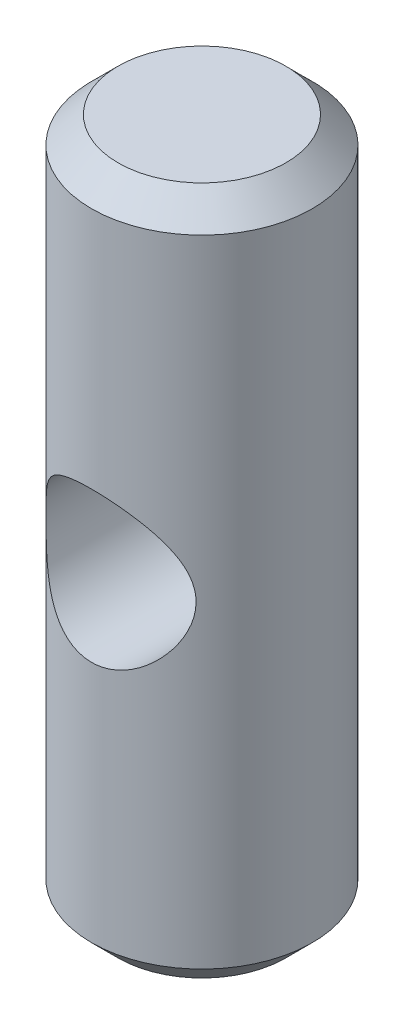
ISO-10303-21;
HEADER;
FILE_DESCRIPTION(('STEP AP214'),'2;1');
FILE_NAME('part.step','',(''),(''),'','','');
FILE_SCHEMA(('AUTOMOTIVE_DESIGN { 1 0 10303 214 1 1 1 1 }'));
ENDSEC;
DATA;
#1=APPLICATION_CONTEXT('core data for automotive mechanical design processes');
#2=APPLICATION_PROTOCOL_DEFINITION('international standard','automotive_design',2000,#1);
#3=PRODUCT_CONTEXT('',#1,'mechanical');
#4=PRODUCT('Part','Part','',(#3));
#5=PRODUCT_RELATED_PRODUCT_CATEGORY('part','',(#4));
#6=PRODUCT_DEFINITION_FORMATION('','',#4);
#7=PRODUCT_DEFINITION_CONTEXT('part definition',#1,'design');
#8=PRODUCT_DEFINITION('design','',#6,#7);
#9=PRODUCT_DEFINITION_SHAPE('','',#8);
#10=(LENGTH_UNIT() NAMED_UNIT(*) SI_UNIT(.MILLI.,.METRE.));
#11=(NAMED_UNIT(*) PLANE_ANGLE_UNIT() SI_UNIT($,.RADIAN.));
#12=(NAMED_UNIT(*) SI_UNIT($,.STERADIAN.) SOLID_ANGLE_UNIT());
#13=UNCERTAINTY_MEASURE_WITH_UNIT(LENGTH_MEASURE(1.E-05),#10,'distance_accuracy_value','');
#14=(GEOMETRIC_REPRESENTATION_CONTEXT(3) GLOBAL_UNCERTAINTY_ASSIGNED_CONTEXT((#13)) GLOBAL_UNIT_ASSIGNED_CONTEXT((#10,
#11,#12)) REPRESENTATION_CONTEXT('',''));
#15=CARTESIAN_POINT('',(0.,0.,0.));
#16=DIRECTION('',(0.,0.,1.));
#17=DIRECTION('',(1.,0.,0.));
#18=AXIS2_PLACEMENT_3D('',#15,#16,#17);
#19=CARTESIAN_POINT('',(0.,39.,0.));
#20=DIRECTION('',(0.,-1.,0.));
#21=DIRECTION('',(0.,0.,-1.));
#22=AXIS2_PLACEMENT_3D('',#19,#20,#21);
#23=CYLINDRICAL_SURFACE('',#22,12.5);
#24=CARTESIAN_POINT('',(0.,-36.,0.));
#25=DIRECTION('',(0.,1.,0.));
#26=DIRECTION('',(0.,0.,1.));
#27=AXIS2_PLACEMENT_3D('',#24,#25,#26);
#28=CIRCLE('',#27,12.5);
#29=CARTESIAN_POINT('',(0.,-36.,12.5));
#30=VERTEX_POINT('',#29);
#31=EDGE_CURVE('E43',#30,#30,#28,.T.);
#32=ORIENTED_EDGE('',*,*,#31,.T.);
#33=EDGE_LOOP('',(#32));
#34=FACE_BOUND('',#33,.T.);
#35=CARTESIAN_POINT('',(0.,36.,0.));
#36=DIRECTION('',(0.,1.,0.));
#37=DIRECTION('',(0.,0.,1.));
#38=AXIS2_PLACEMENT_3D('',#35,#36,#37);
#39=CIRCLE('',#38,12.5);
#40=CARTESIAN_POINT('',(0.,36.,12.5));
#41=VERTEX_POINT('',#40);
#42=EDGE_CURVE('E47',#41,#41,#39,.F.);
#43=ORIENTED_EDGE('',*,*,#42,.T.);
#44=EDGE_LOOP('',(#43));
#45=FACE_BOUND('',#44,.T.);
#46=CARTESIAN_POINT('',(0.,8.5,-12.5));
#47=CARTESIAN_POINT('',(-0.212611229406529,8.49999916390741,-12.4999992129301));
#48=CARTESIAN_POINT('',(-0.425235324985798,8.49201135696874,-12.4945635526216));
#49=CARTESIAN_POINT('',(-0.848748096912108,8.46018514502909,-12.4729546709161));
#50=CARTESIAN_POINT('',(-1.05963663672391,8.43634550481497,-12.4567806127574));
#51=CARTESIAN_POINT('',(-1.47813144874978,8.37316767042175,-12.4140805147799));
#52=CARTESIAN_POINT('',(-1.68573577573116,8.33382062424304,-12.3875485625085));
#53=CARTESIAN_POINT('',(-2.09603319242796,8.24020192526076,-12.3247605864052));
#54=CARTESIAN_POINT('',(-2.29872630768198,8.18593035008376,-12.2885046131505));
#55=CARTESIAN_POINT('',(-2.6968778205928,8.06349857846303,-12.2072897287299));
#56=CARTESIAN_POINT('',(-2.89236813271904,7.99541143656719,-12.1623766550361));
#57=CARTESIAN_POINT('',(-3.27622640483553,7.84594082403003,-12.0646421761312));
#58=CARTESIAN_POINT('',(-3.46459154778754,7.76455216072528,-12.0118176831271));
#59=CARTESIAN_POINT('',(-3.83321341938541,7.58934124360816,-11.8993103261073));
#60=CARTESIAN_POINT('',(-4.01347330451248,7.49552388714578,-11.8396301646949));
#61=CARTESIAN_POINT('',(-4.36534472829236,7.29621057492003,-11.7144651992292));
#62=CARTESIAN_POINT('',(-4.53695302658439,7.19071029003908,-11.6489782452681));
#63=CARTESIAN_POINT('',(-5.06667233733592,6.83873972145533,-11.4338002865402));
#64=CARTESIAN_POINT('',(-5.40791044131656,6.57183587234888,-11.275289082089));
#65=CARTESIAN_POINT('',(-6.04383553620056,5.99230020090763,-10.9476160988973));
#66=CARTESIAN_POINT('',(-6.3384531323822,5.67960152048925,-10.7784389576852));
#67=CARTESIAN_POINT('',(-6.76524031079195,5.15207751469636,-10.5126540168838));
#68=CARTESIAN_POINT('',(-6.91391766961813,4.95081833390409,-10.4152047270699));
#69=CARTESIAN_POINT('',(-7.19372836011809,4.53466127983462,-10.2239406887833));
#70=CARTESIAN_POINT('',(-7.32485747873144,4.31976014953013,-10.1301268169452));
#71=CARTESIAN_POINT('',(-7.56837784801758,3.87728453965254,-9.94950319761833));
#72=CARTESIAN_POINT('',(-7.68079896595189,3.64973104981911,-9.86268240232268));
#73=CARTESIAN_POINT('',(-7.88596866332237,3.1822339365503,-9.69941732082144));
#74=CARTESIAN_POINT('',(-7.9787168962926,2.94229009499671,-9.62297321737187));
#75=CARTESIAN_POINT('',(-8.1184983232508,2.52448279835234,-9.50503456510722));
#76=CARTESIAN_POINT('',(-8.17091788226446,2.34942992045086,-9.45991392681687));
#77=CARTESIAN_POINT('',(-8.26470838093257,1.99455320219841,-9.37808462233733));
#78=CARTESIAN_POINT('',(-8.30608643424035,1.81473251608635,-9.34137054227339));
#79=CARTESIAN_POINT('',(-8.37721986170618,1.45134940351048,-9.2776329492738));
#80=CARTESIAN_POINT('',(-8.40699037275046,1.26779218079923,-9.25059681954442));
#81=CARTESIAN_POINT('',(-8.45450274260778,0.897860127591479,-9.20719421658495));
#82=CARTESIAN_POINT('',(-8.47224456881083,0.711485289457778,-9.19082777228057));
#83=CARTESIAN_POINT('',(-8.49542774911736,0.336415887727097,-9.16940360323845));
#84=CARTESIAN_POINT('',(-8.50080981047673,0.147714490288373,-9.16440039189994));
#85=CARTESIAN_POINT('',(-8.49899309832957,-0.229574503370256,-9.16608517417559));
#86=CARTESIAN_POINT('',(-8.49179431975344,-0.418162099544272,-9.17277317250089));
#87=CARTESIAN_POINT('',(-8.46494901569467,-0.793801379472154,-9.19755223152106));
#88=CARTESIAN_POINT('',(-8.44529473460822,-0.98085203266486,-9.21565039688983));
#89=CARTESIAN_POINT('',(-8.3938913628403,-1.3519170463609,-9.26249376281584));
#90=CARTESIAN_POINT('',(-8.3621419958866,-1.53593133740841,-9.29123920657452));
#91=CARTESIAN_POINT('',(-8.28904286578348,-1.8901654020036,-9.35649660943276));
#92=CARTESIAN_POINT('',(-8.2482895562009,-2.06060006973876,-9.39251749110932));
#93=CARTESIAN_POINT('',(-8.15687607698334,-2.39703838226236,-9.47201379261136));
#94=CARTESIAN_POINT('',(-8.10621222038424,-2.56304035177818,-9.51549198599408));
#95=CARTESIAN_POINT('',(-7.94004717374606,-3.05365736865759,-9.6553911026255));
#96=CARTESIAN_POINT('',(-7.81036608355042,-3.37091404825548,-9.76128254981763));
#97=CARTESIAN_POINT('',(-7.5543637023359,-3.90455677210809,-9.95995741389655));
#98=CARTESIAN_POINT('',(-7.43561726211521,-4.12603609917096,-10.0491983821259));
#99=CARTESIAN_POINT('',(-7.18015660851213,-4.55608081630591,-10.2332855426676));
#100=CARTESIAN_POINT('',(-7.04343574552231,-4.76464138489007,-10.3281338022064));
#101=CARTESIAN_POINT('',(-6.75265789244995,-5.16852530921714,-10.5205544166205));
#102=CARTESIAN_POINT('',(-6.59857255721548,-5.36382616273829,-10.6181310241277));
#103=CARTESIAN_POINT('',(-6.27388868221983,-5.74021551780517,-10.8131484907168));
#104=CARTESIAN_POINT('',(-6.10329207879088,-5.92130568138705,-10.9105893643605));
#105=CARTESIAN_POINT('',(-5.74454430317502,-6.27003459745637,-11.1036963668885));
#106=CARTESIAN_POINT('',(-5.55625225597375,-6.43754140433818,-11.199339426626));
#107=CARTESIAN_POINT('',(-5.16396350310391,-6.75628192618958,-11.3855443251041));
#108=CARTESIAN_POINT('',(-4.9599654234511,-6.90751421466186,-11.4761057180928));
#109=CARTESIAN_POINT('',(-4.53740472159617,-7.19212977307887,-11.6496366590009));
#110=CARTESIAN_POINT('',(-4.31886875033327,-7.32554442533664,-11.7326194713579));
#111=CARTESIAN_POINT('',(-3.86797195499053,-7.5733024862078,-11.8888885095943));
#112=CARTESIAN_POINT('',(-3.63561531819141,-7.68765163161509,-11.9621776509134));
#113=CARTESIAN_POINT('',(-3.21144130470798,-7.87259042083719,-12.0819654469364));
#114=CARTESIAN_POINT('',(-3.02205326651101,-7.94726158835922,-12.1308016584786));
#115=CARTESIAN_POINT('',(-2.63670087538951,-8.08328742186423,-12.2203482439586));
#116=CARTESIAN_POINT('',(-2.44073782030192,-8.14464469821701,-12.2610602106394));
#117=CARTESIAN_POINT('',(-2.04341856904869,-8.25329241278791,-12.3334989745208));
#118=CARTESIAN_POINT('',(-1.84206499338535,-8.30058955542913,-12.3652300538139));
#119=CARTESIAN_POINT('',(-1.43518188941923,-8.38052709990866,-12.4190321476114));
#120=CARTESIAN_POINT('',(-1.22965226709328,-8.41316717136179,-12.441102944363));
#121=CARTESIAN_POINT('',(-0.815207190454656,-8.46340091238257,-12.4751277150926));
#122=CARTESIAN_POINT('',(-0.606282567497379,-8.48094279501703,-12.4870468673847));
#123=CARTESIAN_POINT('',(-0.187370529507908,-8.5005210630142,-12.5003522522041));
#124=CARTESIAN_POINT('',(0.022616884653461,-8.50255746107965,-12.5017384933603));
#125=CARTESIAN_POINT('',(0.441977632879437,-8.49109288060541,-12.4939441725854));
#126=CARTESIAN_POINT('',(0.651350937217888,-8.47759116198793,-12.4847631073353));
#127=CARTESIAN_POINT('',(1.06781626073916,-8.43525792222966,-12.4560561283182));
#128=CARTESIAN_POINT('',(1.27490833558742,-8.40642677599951,-12.4365304675482));
#129=CARTESIAN_POINT('',(1.67428781800202,-8.33580620011289,-12.3889073455685));
#130=CARTESIAN_POINT('',(1.86677484519456,-8.29479186339276,-12.3613238997183));
#131=CARTESIAN_POINT('',(2.24721772650369,-8.19990622798389,-12.2978542116027));
#132=CARTESIAN_POINT('',(2.43517201084202,-8.14603054360643,-12.2619651372658));
#133=CARTESIAN_POINT('',(2.80541670195474,-8.02605126266958,-12.1825890609117));
#134=CARTESIAN_POINT('',(2.98770864248847,-7.95995101171516,-12.1391041378977));
#135=CARTESIAN_POINT('',(3.34590416619502,-7.81614954581966,-12.0452988690557));
#136=CARTESIAN_POINT('',(3.52180537622698,-7.73844407503484,-11.9949760162484));
#137=CARTESIAN_POINT('',(3.88031205030355,-7.56544076962018,-11.8840705305856));
#138=CARTESIAN_POINT('',(4.06232426080535,-7.4692319439576,-11.822988789701));
#139=CARTESIAN_POINT('',(4.41740035751952,-7.26488731836294,-11.6949675512413));
#140=CARTESIAN_POINT('',(4.5904604253694,-7.15674648968412,-11.6280255863472));
#141=CARTESIAN_POINT('',(5.09553911437629,-6.81546087342391,-11.4200600711919));
#142=CARTESIAN_POINT('',(5.41350998148693,-6.5654267388732,-11.2718797237288));
#143=CARTESIAN_POINT('',(5.88447632341429,-6.13824246087119,-11.0300157872951));
#144=CARTESIAN_POINT('',(6.05109822364662,-5.97401067710243,-10.9392888561071));
#145=CARTESIAN_POINT('',(6.36999669503495,-5.6327287892332,-10.7567107993367));
#146=CARTESIAN_POINT('',(6.52227604622003,-5.45568118105035,-10.6648598955309));
#147=CARTESIAN_POINT('',(6.81208921698919,-5.0892087209444,-10.4821186841034));
#148=CARTESIAN_POINT('',(6.9496134269689,-4.899775930587,-10.3912290368342));
#149=CARTESIAN_POINT('',(7.2091725737248,-4.50919739117481,-10.212867133094));
#150=CARTESIAN_POINT('',(7.33120999976475,-4.30805353209668,-10.1253943289862));
#151=CARTESIAN_POINT('',(7.64131171747821,-3.74504307831762,-9.89544194142684));
#152=CARTESIAN_POINT('',(7.81365560029482,-3.37172386163579,-9.75870050072533));
#153=CARTESIAN_POINT('',(8.03185839695519,-2.78965723987428,-9.5785289780129));
#154=CARTESIAN_POINT('',(8.09785246373816,-2.59205087771646,-9.52264880061389));
#155=CARTESIAN_POINT('',(8.21569108391976,-2.19002993966031,-9.42117069089606));
#156=CARTESIAN_POINT('',(8.26753853402292,-1.98561676717834,-9.375570653917));
#157=CARTESIAN_POINT('',(8.34891457244461,-1.6053011127204,-9.30312255176955));
#158=CARTESIAN_POINT('',(8.38071060614132,-1.43023273327679,-9.27442445038085));
#159=CARTESIAN_POINT('',(8.43335759447562,-1.07717839228988,-9.22657851080832));
#160=CARTESIAN_POINT('',(8.45421074489629,-0.899193023462777,-9.20742875670543));
#161=CARTESIAN_POINT('',(8.48462590513332,-0.541575160788092,-9.17940927863587));
#162=CARTESIAN_POINT('',(8.49419587547127,-0.361943918418938,-9.17053230708616));
#163=CARTESIAN_POINT('',(8.50190326230583,-0.00221826905569822,-9.1633874625019));
#164=CARTESIAN_POINT('',(8.50004044888093,0.177876147180341,-9.16511980282825));
#165=CARTESIAN_POINT('',(8.48491973775006,0.537055645604599,-9.17911982332172));
#166=CARTESIAN_POINT('',(8.47166896204319,0.716141288232062,-9.19138091883147));
#167=CARTESIAN_POINT('',(8.43401190841614,1.07214121355693,-9.2259466375048));
#168=CARTESIAN_POINT('',(8.40960570874408,1.24905551147599,-9.24825119021997));
#169=CARTESIAN_POINT('',(8.34999087744399,1.59979027325011,-9.30211059217691));
#170=CARTESIAN_POINT('',(8.31477174417639,1.77360755484554,-9.33367443280799));
#171=CARTESIAN_POINT('',(8.23399688640742,2.11718373164182,-9.4050090004596));
#172=CARTESIAN_POINT('',(8.18843529403792,2.28694026227548,-9.44478438519404));
#173=CARTESIAN_POINT('',(8.07133858065293,2.67520382969941,-9.54521836203062));
#174=CARTESIAN_POINT('',(7.99615670437936,2.89194177930876,-9.60848763482577));
#175=CARTESIAN_POINT('',(7.82977778562174,3.31610119313207,-9.74454307136207));
#176=CARTESIAN_POINT('',(7.73857476504883,3.52351914329788,-9.81733278493737));
#177=CARTESIAN_POINT('',(7.54100901203986,3.92861609861968,-9.96989338780853));
#178=CARTESIAN_POINT('',(7.43462915211643,4.12628375644267,-10.0496721246119));
#179=CARTESIAN_POINT('',(7.20756400400657,4.5112031222072,-10.2137476160052));
#180=CARTESIAN_POINT('',(7.08687969143419,4.69845553922644,-10.2980440622568));
#181=CARTESIAN_POINT('',(6.82924274151675,5.06584454227428,-10.4707196427112));
#182=CARTESIAN_POINT('',(6.69201335046604,5.24576434327886,-10.5591466909608));
#183=CARTESIAN_POINT('',(6.40372122532589,5.59405742314174,-10.7364335060975));
#184=CARTESIAN_POINT('',(6.25265324016938,5.76242627624611,-10.8252934250271));
#185=CARTESIAN_POINT('',(5.93711876139708,6.0870234387961,-11.0015125380574));
#186=CARTESIAN_POINT('',(5.7726502369996,6.24324990109033,-11.0888715022583));
#187=CARTESIAN_POINT('',(5.43075906662421,6.54282142578617,-11.2602586816036));
#188=CARTESIAN_POINT('',(5.25333683727211,6.68616690214426,-11.3442870037365));
#189=CARTESIAN_POINT('',(4.86280344788978,6.97635617744866,-11.5175664782057));
#190=CARTESIAN_POINT('',(4.64801393352486,7.12135889779645,-11.6061386832676));
#191=CARTESIAN_POINT('',(4.20346535730454,7.39247293121866,-11.7744368948176));
#192=CARTESIAN_POINT('',(3.97370392709394,7.51858124499237,-11.854161496316));
#193=CARTESIAN_POINT('',(3.50095025371569,7.74999907866131,-12.0022746388594));
#194=CARTESIAN_POINT('',(3.25798165837103,7.85534430590749,-12.0706826085549));
#195=CARTESIAN_POINT('',(2.76031494250419,8.04371560633565,-12.1941088824536));
#196=CARTESIAN_POINT('',(2.50562230406701,8.12675198927174,-12.249133370549));
#197=CARTESIAN_POINT('',(2.06534954894268,8.24739792519664,-12.329567052311));
#198=CARTESIAN_POINT('',(1.88214205575194,8.29115225681945,-12.3589009427645));
#199=CARTESIAN_POINT('',(1.51217598659128,8.36653680966855,-12.4095993153829));
#200=CARTESIAN_POINT('',(1.32541809579887,8.39816934579647,-12.4309653191557));
#201=CARTESIAN_POINT('',(0.949520469364699,8.4489269775882,-12.4653126060539));
#202=CARTESIAN_POINT('',(0.760381715142791,8.46805706525246,-12.4782972356842));
#203=CARTESIAN_POINT('',(0.380832179850978,8.49359470711208,-12.495641797779));
#204=CARTESIAN_POINT('',(0.190421250259457,8.50000074883061,-12.5000007049244));
#205=CARTESIAN_POINT('',(0.,8.5,-12.5));
#206=B_SPLINE_CURVE_WITH_KNOTS('',3,(#46,#47,#48,#49,#50,#51,#52,#53,#54,#55,#56,#57,#58,#59,
#60,#61,#62,#63,#64,#65,#66,#67,#68,#69,#70,#71,#72,#73,#74,#75,#76,#77,#78,#79,#80,#81,#82,#83,
#84,#85,#86,#87,#88,#89,#90,#91,#92,#93,#94,#95,#96,#97,#98,#99,#100,#101,#102,#103,#104,#105,
#106,#107,#108,#109,#110,#111,#112,#113,#114,#115,#116,#117,#118,#119,#120,#121,#122,#123,#124,
#125,#126,#127,#128,#129,#130,#131,#132,#133,#134,#135,#136,#137,#138,#139,#140,#141,#142,#143,
#144,#145,#146,#147,#148,#149,#150,#151,#152,#153,#154,#155,#156,#157,#158,#159,#160,#161,#162,
#163,#164,#165,#166,#167,#168,#169,#170,#171,#172,#173,#174,#175,#176,#177,#178,#179,#180,#181,
#182,#183,#184,#185,#186,#187,#188,#189,#190,#191,#192,#193,#194,#195,#196,#197,#198,#199,#200,
#201,#202,#203,#204,#205),.UNSPECIFIED.,.T.,.F.,(4,2,2,2,2,2,2,2,2,2,2,2,2,2,2,2,2,2,2,2,2,2,2,
2,2,2,2,2,2,2,2,2,2,2,2,2,2,2,2,2,2,2,2,2,2,2,2,2,2,2,2,2,2,2,2,2,2,2,2,2,2,2,2,2,2,2,2,2,2,2,2,
2,2,2,2,2,2,2,2,4),(0.,0.637638569316176,1.27532683079304,1.91337962848084,2.55142910754344,
3.18618871327801,3.82119671172004,4.45595523440743,5.09094975939609,6.46937914241849,
7.84984140223583,8.65461300195753,9.45957746955408,10.2632442217744,11.0669251264715,
11.6310837059482,12.1948779355317,12.7579344669572,13.3209925248329,13.8867461142772,
14.4524999316996,15.0186063707375,15.5847257413799,16.1209085432474,16.6572911988076,
17.729962068664,18.5291174726279,19.3285693591328,20.129345680615,20.9300282058792,
21.7377350551793,22.5455126441933,23.351848178703,24.1579406479864,24.7853694223414,
25.4126750693585,26.0396811108585,26.6667012849986,27.2958636699022,27.9250255393692,
28.5542173769459,29.1833938271328,29.7789366809116,30.3746829041909,30.9702663249758,
31.566068695707,32.2096414263224,32.8534864344468,34.1409914628099,34.893197555009,
35.6452575450771,36.3978043947685,37.1502301304353,38.4443718771902,39.0908409976289,
39.7371776455615,40.2773148354423,40.8173436006944,41.3569911358348,41.8966495237113,
42.4359706561683,42.9752880056927,43.5151308120085,44.0552806709294,44.7681537714426,
45.4812934388263,46.1952443656952,46.9091466265849,47.6373057820495,48.3657423918077,
49.0942895983837,49.8228133832457,50.6432675911966,51.463851900488,52.2830124533647,
53.1017937876742,53.673152307973,54.2444016613844,54.8154227857347,55.3865117819357),.UNSPECIFIED.);
#207=CARTESIAN_POINT('',(0.,8.5,-12.5));
#208=VERTEX_POINT('',#207);
#209=EDGE_CURVE('E52',#208,#208,#206,.T.);
#210=ORIENTED_EDGE('',*,*,#209,.T.);
#211=EDGE_LOOP('',(#210));
#212=FACE_BOUND('',#211,.T.);
#213=CARTESIAN_POINT('',(8.5,0.,9.16515138991168));
#214=CARTESIAN_POINT('',(8.49999848103352,-0.206088728048638,9.16515435137744));
#215=CARTESIAN_POINT('',(8.49248800048587,-0.412212060655004,9.17213583057471));
#216=CARTESIAN_POINT('',(8.46261532781039,-0.82248269577884,9.1997032500682));
#217=CARTESIAN_POINT('',(8.44024911507194,-1.0266294481677,9.22029287331568));
#218=CARTESIAN_POINT('',(8.3811034442874,-1.43143853036613,9.27408730137549));
#219=CARTESIAN_POINT('',(8.34430186283791,-1.63209501573086,9.3073114672796));
#220=CARTESIAN_POINT('',(8.25695470058672,-2.02827116070182,9.38488691971489));
#221=CARTESIAN_POINT('',(8.20640187372764,-2.22378805232506,9.42924407168693));
#222=CARTESIAN_POINT('',(8.09292937857939,-2.60651269076972,9.52680514030859));
#223=CARTESIAN_POINT('',(8.03014703841639,-2.7937867192509,9.57990988979939));
#224=CARTESIAN_POINT('',(7.89263199756951,-3.16147211352694,9.69352020888648));
#225=CARTESIAN_POINT('',(7.81790087738243,-3.34188438304342,9.75402479943769));
#226=CARTESIAN_POINT('',(7.5766884397089,-3.87228632386058,9.94412008782076));
#227=CARTESIAN_POINT('',(7.39312795371831,-4.21164033238037,10.0823463734539));
#228=CARTESIAN_POINT('',(7.0702508993189,-4.72346898058283,10.3093525360843));
#229=CARTESIAN_POINT('',(6.94452130536774,-4.90639680333772,10.3946444109643));
#230=CARTESIAN_POINT('',(6.67951741016981,-5.26147264248069,10.5668815131737));
#231=CARTESIAN_POINT('',(6.54024093789126,-5.43361892372062,10.6538270037107));
#232=CARTESIAN_POINT('',(6.24847211705666,-5.76677475148638,10.8275327870459));
#233=CARTESIAN_POINT('',(6.09596586520745,-5.92777225428574,10.9142927843839));
#234=CARTESIAN_POINT('',(5.77824797680766,-6.23787798047955,11.0857764344671));
#235=CARTESIAN_POINT('',(5.61303651934248,-6.38698637139588,11.1705001158931));
#236=CARTESIAN_POINT('',(5.24396777814774,-6.69455134158231,11.3489649684113));
#237=CARTESIAN_POINT('',(5.03807127007633,-6.85092906699646,11.4420938236212));
#238=CARTESIAN_POINT('',(4.61060952227589,-7.14560475266041,11.6209276386172));
#239=CARTESIAN_POINT('',(4.38904162928076,-7.2838996400245,11.7066313357849));
#240=CARTESIAN_POINT('',(3.93167037859807,-7.54059872775556,11.8680532183401));
#241=CARTESIAN_POINT('',(3.69588915266799,-7.65903281886527,11.9437863719154));
#242=CARTESIAN_POINT('',(3.21133572211425,-7.8744872130227,12.0830786875566));
#243=CARTESIAN_POINT('',(2.96256879539231,-7.97151613345675,12.1466427473417));
#244=CARTESIAN_POINT('',(2.51940835104151,-8.12048949225855,12.2450026092391));
#245=CARTESIAN_POINT('',(2.32744758813441,-8.17761353995428,12.2829947849229));
#246=CARTESIAN_POINT('',(1.93855933051281,-8.27842440905489,12.3503400478085));
#247=CARTESIAN_POINT('',(1.74163284484189,-8.32211393694643,12.3796948750187));
#248=CARTESIAN_POINT('',(1.34415899673727,-8.39547825599371,12.4291319561483));
#249=CARTESIAN_POINT('',(1.14361390688543,-8.42516154578204,12.4492198328542));
#250=CARTESIAN_POINT('',(0.740172438537701,-8.47014398577306,12.4797061168245));
#251=CARTESIAN_POINT('',(0.537275982330194,-8.48544265919019,12.4901042029156));
#252=CARTESIAN_POINT('',(0.130292677784315,-8.50144499579772,12.5009812517458));
#253=CARTESIAN_POINT('',(-0.0737956130943463,-8.50212364913506,12.5014432171794));
#254=CARTESIAN_POINT('',(-0.48126845617013,-8.48881228385607,12.4923941008278));
#255=CARTESIAN_POINT('',(-0.684653010975166,-8.47482231965742,12.4828830560406));
#256=CARTESIAN_POINT('',(-1.08925251926926,-8.43237316575784,12.4541027119486));
#257=CARTESIAN_POINT('',(-1.29046693379805,-8.40391046253482,12.4348310430782));
#258=CARTESIAN_POINT('',(-1.68926040926245,-8.33291196470857,12.3869582752026));
#259=CARTESIAN_POINT('',(-1.88683945822216,-8.29037612375324,12.3583571454694));
#260=CARTESIAN_POINT('',(-2.27341125751405,-8.19271606831157,12.2930591969054));
#261=CARTESIAN_POINT('',(-2.46249567210535,-8.13784446889485,12.2565252803728));
#262=CARTESIAN_POINT('',(-2.83498515320651,-8.01569065240001,12.1757627196494));
#263=CARTESIAN_POINT('',(-3.01838819594679,-7.94840407100619,12.1315313698437));
#264=CARTESIAN_POINT('',(-3.37855314009498,-7.8021242233848,12.0361979722602));
#265=CARTESIAN_POINT('',(-3.55531685315285,-7.72313418015828,11.9850978164322));
#266=CARTESIAN_POINT('',(-3.90160552151597,-7.55411389413234,11.8768867769885));
#267=CARTESIAN_POINT('',(-4.07112783111474,-7.46407966198255,11.8197737224727));
#268=CARTESIAN_POINT('',(-4.60515263764892,-7.15702515533221,11.6273640591456));
#269=CARTESIAN_POINT('',(-4.95443467378754,-6.91941946360894,11.4819087248686));
#270=CARTESIAN_POINT('',(-5.61048966004968,-6.39907800227535,11.1760341307864));
#271=CARTESIAN_POINT('',(-5.91721289759742,-6.11629027143199,11.0155977314986));
#272=CARTESIAN_POINT('',(-6.36728205780273,-5.63619465118874,10.7584574722756));
#273=CARTESIAN_POINT('',(-6.52562305429753,-5.45208481303523,10.6629213780352));
#274=CARTESIAN_POINT('',(-6.82630605473487,-5.07055692129286,10.4729720040763));
#275=CARTESIAN_POINT('',(-6.96864485838239,-4.87313621823486,10.3785589523202));
#276=CARTESIAN_POINT('',(-7.23654495126266,-4.46563149875463,10.1935722563913));
#277=CARTESIAN_POINT('',(-7.36211199511762,-4.25555186187498,10.1029973026346));
#278=CARTESIAN_POINT('',(-7.59563797334545,-3.82316808017902,9.92862060231437));
#279=CARTESIAN_POINT('',(-7.70360245559496,-3.60086781664319,9.84481672589768));
#280=CARTESIAN_POINT('',(-7.87744955410163,-3.19871149281721,9.70593012274128));
#281=CARTESIAN_POINT('',(-7.94724371410613,-3.02126590529237,9.64874475825135));
#282=CARTESIAN_POINT('',(-8.07530611883444,-2.66009809103175,9.54182315551202));
#283=CARTESIAN_POINT('',(-8.13357730307947,-2.476377479121,9.49208501825664));
#284=CARTESIAN_POINT('',(-8.23787325719613,-2.10353590742439,9.40171308048351));
#285=CARTESIAN_POINT('',(-8.28391305254534,-1.91442189246215,9.36106811936883));
#286=CARTESIAN_POINT('',(-8.36314474689064,-1.53165800275521,9.29035184375984));
#287=CARTESIAN_POINT('',(-8.39634341794788,-1.33801057611303,9.26027495671818));
#288=CARTESIAN_POINT('',(-8.44956721836602,-0.945692041994092,9.21173887830028));
#289=CARTESIAN_POINT('',(-8.46947419807787,-0.746991763222282,9.19338394417147));
#290=CARTESIAN_POINT('',(-8.49523044262475,-0.347903872938088,9.16958957563399));
#291=CARTESIAN_POINT('',(-8.50107999980425,-0.147516296602473,9.1641498726344));
#292=CARTESIAN_POINT('',(-8.49859215529454,0.253093847137906,9.16645695363142));
#293=CARTESIAN_POINT('',(-8.49025465520226,0.453316413388503,9.17420382909166));
#294=CARTESIAN_POINT('',(-8.45957672496459,0.851756835090895,9.20249925457852));
#295=CARTESIAN_POINT('',(-8.43723660531876,1.04997473489591,9.22304752074206));
#296=CARTESIAN_POINT('',(-8.38234977035324,1.4202539438099,9.27293958236994));
#297=CARTESIAN_POINT('',(-8.35126652077466,1.59270907583355,9.30100519977012));
#298=CARTESIAN_POINT('',(-8.27891598055431,1.93390828312786,9.36546286410257));
#299=CARTESIAN_POINT('',(-8.23764498671888,2.10265098460301,9.40185793839909));
#300=CARTESIAN_POINT('',(-8.09920438866342,2.60235745564956,9.52196552448908));
#301=CARTESIAN_POINT('',(-7.98740749031453,2.92679747092542,9.61660009122972));
#302=CARTESIAN_POINT('',(-7.76406944710815,3.46846651899267,9.79713340382956));
#303=CARTESIAN_POINT('',(-7.66076855638965,3.6908092868739,9.87837957197693));
#304=CARTESIAN_POINT('',(-7.43668030925491,4.1237308603243,10.0481614663021));
#305=CARTESIAN_POINT('',(-7.31588641170573,4.33430522435024,10.1366999139061));
#306=CARTESIAN_POINT('',(-7.05755511051301,4.74336953550824,10.3182305157256));
#307=CARTESIAN_POINT('',(-6.9199913389539,4.94183969620749,10.4112295405373));
#308=CARTESIAN_POINT('',(-6.6289650617256,5.32586600935381,10.5989056436404));
#309=CARTESIAN_POINT('',(-6.47550429941205,5.51142357414732,10.6935825369852));
#310=CARTESIAN_POINT('',(-6.15090881561908,5.87162099499198,10.8835743426256));
#311=CARTESIAN_POINT('',(-5.97955300749704,6.04606711246697,10.9788790600963));
#312=CARTESIAN_POINT('',(-5.62152225032707,6.38031823732259,11.1664376651947));
#313=CARTESIAN_POINT('',(-5.4348461707565,6.54012216237287,11.2586913269709));
#314=CARTESIAN_POINT('',(-5.04701734410803,6.84384351968125,11.4377960077872));
#315=CARTESIAN_POINT('',(-4.84588487373397,6.98778251264816,11.5246542873473));
#316=CARTESIAN_POINT('',(-4.42966325122995,7.25876819250256,11.6909483753739));
#317=CARTESIAN_POINT('',(-4.21457708638763,7.38581847738029,11.7703857637206));
#318=CARTESIAN_POINT('',(-3.8103676814612,7.60091562227886,11.9066482210212));
#319=CARTESIAN_POINT('',(-3.62331315699271,7.69189434623213,11.9649950072684));
#320=CARTESIAN_POINT('',(-3.24118379552441,7.86055502982749,12.0741123304867));
#321=CARTESIAN_POINT('',(-3.04611042740105,7.93823941135962,12.1248842471893));
#322=CARTESIAN_POINT('',(-2.64898456574907,8.07943498400338,12.2177921267493));
#323=CARTESIAN_POINT('',(-2.44693506262307,8.14295216304681,12.2599317375339));
#324=CARTESIAN_POINT('',(-2.03698952979335,8.25504833242399,12.3346697076918));
#325=CARTESIAN_POINT('',(-1.82909342825783,8.30362713913604,12.3672679497829));
#326=CARTESIAN_POINT('',(-1.40786635197289,8.38535402954421,12.4222881658997));
#327=CARTESIAN_POINT('',(-1.19451359000308,8.41842464178954,12.444659035257));
#328=CARTESIAN_POINT('',(-0.765042387357296,8.46826065674087,12.4784254522543));
#329=CARTESIAN_POINT('',(-0.548923940486889,8.48502602292071,12.4898209753078));
#330=CARTESIAN_POINT('',(-0.115773629314079,8.50197421680752,12.5013410054429));
#331=CARTESIAN_POINT('',(0.101258071482119,8.50215989629495,12.5014674508564));
#332=CARTESIAN_POINT('',(0.534404324530495,8.48595163262076,12.4904499089418));
#333=CARTESIAN_POINT('',(0.750518927113385,8.46955861143738,12.4793065483525));
#334=CARTESIAN_POINT('',(1.16241743812834,8.42248049955046,12.4474056750359));
#335=CARTESIAN_POINT('',(1.35841686789454,8.39307583105217,12.4275102687628));
#336=CARTESIAN_POINT('',(1.74688971829356,8.32090248080877,12.3788814682301));
#337=CARTESIAN_POINT('',(1.93936192547817,8.27812928806603,12.3501450907756));
#338=CARTESIAN_POINT('',(2.31949660045235,8.17976012888763,12.2844266338982));
#339=CARTESIAN_POINT('',(2.50716024813584,8.12416734217823,12.2474465992782));
#340=CARTESIAN_POINT('',(2.87680266763823,8.00074950507985,12.1659297205088));
#341=CARTESIAN_POINT('',(3.05877922007526,7.93291974747031,12.1213899687392));
#342=CARTESIAN_POINT('',(3.42502338753252,7.78205387199987,12.0231826731012));
#343=CARTESIAN_POINT('',(3.60895648656006,7.69843014276207,11.9691718279184));
#344=CARTESIAN_POINT('',(3.96887157093935,7.51920837118769,11.8546927188142));
#345=CARTESIAN_POINT('',(4.1448506436124,7.42360598997063,11.7942221162301));
#346=CARTESIAN_POINT('',(4.48818758741184,7.22121052996686,11.6678888493749));
#347=CARTESIAN_POINT('',(4.65554628513358,7.11441852712762,11.6020267036652));
#348=CARTESIAN_POINT('',(4.98122598477094,6.89031710836147,11.4659732144009));
#349=CARTESIAN_POINT('',(5.13954593071523,6.7730064676709,11.3957813670045));
#350=CARTESIAN_POINT('',(5.47100763974769,6.50920384126855,11.2408452514058));
#351=CARTESIAN_POINT('',(5.64255328442261,6.36102654779215,11.1555508703671));
#352=CARTESIAN_POINT('',(5.97261424917881,6.05218750694922,10.9823777402567));
#353=CARTESIAN_POINT('',(6.13112820936108,5.89152446004779,10.8944987227656));
#354=CARTESIAN_POINT('',(6.43506912146338,5.55795958578322,10.7177821560741));
#355=CARTESIAN_POINT('',(6.5804647014258,5.3850300987681,10.6289428498397));
#356=CARTESIAN_POINT('',(6.85726418389388,5.02781977083319,10.4525049753565));
#357=CARTESIAN_POINT('',(6.98867228429584,4.84354236198784,10.3649060417307));
#358=CARTESIAN_POINT('',(7.25348598690173,4.43879738884499,10.1816587502149));
#359=CARTESIAN_POINT('',(7.38484786897896,4.21677037158985,10.086482378698));
#360=CARTESIAN_POINT('',(7.62800421325966,3.75908521680873,9.90387210550152));
#361=CARTESIAN_POINT('',(7.73979297035631,3.52342313152184,9.81644046488626));
#362=CARTESIAN_POINT('',(7.94202112916635,3.04016642034811,9.65355456916812));
#363=CARTESIAN_POINT('',(8.03253732346735,2.79261872514166,9.57805756441742));
#364=CARTESIAN_POINT('',(8.19100322537332,2.28642961869638,9.44289751453995));
#365=CARTESIAN_POINT('',(8.25897325314606,2.02779843540385,9.38322022139061));
#366=CARTESIAN_POINT('',(8.37565430688359,1.47786933164728,9.27928856466895));
#367=CARTESIAN_POINT('',(8.42210570039203,1.18571576706158,9.2368855183936));
#368=CARTESIAN_POINT('',(8.46874460583983,0.743269543733732,9.19406014455721));
#369=CARTESIAN_POINT('',(8.48045122910269,0.595069265834193,9.18324817593681));
#370=CARTESIAN_POINT('',(8.49607882508031,0.297918599201243,9.16879332688934));
#371=CARTESIAN_POINT('',(8.50000109796357,0.148968339899435,9.16514924925779));
#372=CARTESIAN_POINT('',(8.5,0.,9.16515138991168));
#373=B_SPLINE_CURVE_WITH_KNOTS('',3,(#213,#214,#215,#216,#217,#218,#219,#220,#221,#222,#223,
#224,#225,#226,#227,#228,#229,#230,#231,#232,#233,#234,#235,#236,#237,#238,#239,#240,#241,#242,
#243,#244,#245,#246,#247,#248,#249,#250,#251,#252,#253,#254,#255,#256,#257,#258,#259,#260,#261,
#262,#263,#264,#265,#266,#267,#268,#269,#270,#271,#272,#273,#274,#275,#276,#277,#278,#279,#280,
#281,#282,#283,#284,#285,#286,#287,#288,#289,#290,#291,#292,#293,#294,#295,#296,#297,#298,#299,
#300,#301,#302,#303,#304,#305,#306,#307,#308,#309,#310,#311,#312,#313,#314,#315,#316,#317,#318,
#319,#320,#321,#322,#323,#324,#325,#326,#327,#328,#329,#330,#331,#332,#333,#334,#335,#336,#337,
#338,#339,#340,#341,#342,#343,#344,#345,#346,#347,#348,#349,#350,#351,#352,#353,#354,#355,#356,
#357,#358,#359,#360,#361,#362,#363,#364,#365,#366,#367,#368,#369,#370,#371,#372),.UNSPECIFIED.,
.T.,.F.,(4,2,2,2,2,2,2,2,2,2,2,2,2,2,2,2,2,2,2,2,2,2,2,2,2,2,2,2,2,2,2,2,2,2,2,2,2,2,2,2,2,2,2,
2,2,2,2,2,2,2,2,2,2,2,2,2,2,2,2,2,2,2,2,2,2,2,2,2,2,2,2,2,2,2,2,2,2,2,2,4),(0.,
0.618076514819961,1.23632037636507,1.85551547358185,2.47503748256103,3.08796676955051,
3.70081504972688,4.92587263263931,5.63876070411443,6.35176321234118,7.0655243152327,
7.77927535919547,8.6025964278708,9.42605722530915,10.2482673598117,11.0701458788783,
11.6810712732917,12.2918735113614,12.9023046519005,13.5127560247829,14.1242515883692,
14.7357448834351,15.3473867006089,15.9590305323418,16.559135815319,17.1594524603585,
17.7596040912055,18.3599731490311,19.6949262927931,21.0314258879502,21.813555274241,
22.5958408021788,23.377857223846,24.1596266955044,24.7563236570903,25.3528682038333,
25.9486765093685,26.5441701719309,27.1448890966779,27.7455955284966,28.3463061269019,
28.9470034053872,29.4788453537582,30.0108809094049,31.074958458916,31.8489288494065,
32.6231894003245,33.3986834449898,34.1740925343604,34.9605742309322,35.7471140163071,
36.5325713465697,37.3178610729758,37.9653245056952,38.6126698612417,39.2597410881232,
39.9068202684523,40.5570983861097,41.2073779604825,41.8575456836366,42.5076772515132,
43.1045651992386,43.7016547752325,44.2985964102589,44.8957681635704,45.5225771067661,
46.1496137512243,46.7765901576819,47.4036396627282,48.1295072357719,48.8554504595842,
49.5830861114968,50.3105027673523,51.1343321664248,51.9584012941395,52.7794482507793,
53.5997531995794,54.4932533016083,54.9400958609378,55.3868637808302),.UNSPECIFIED.);
#374=CARTESIAN_POINT('',(8.5,0.,9.16515138991168));
#375=VERTEX_POINT('',#374);
#376=EDGE_CURVE('E60',#375,#375,#373,.T.);
#377=ORIENTED_EDGE('',*,*,#376,.T.);
#378=EDGE_LOOP('',(#377));
#379=FACE_BOUND('',#378,.T.);
#380=ADVANCED_FACE('F32',(#34,#45,#212,#379),#23,.T.);
#381=CARTESIAN_POINT('',(0.,39.,0.));
#382=DIRECTION('',(0.,1.,0.));
#383=DIRECTION('',(0.,0.,1.));
#384=AXIS2_PLACEMENT_3D('',#381,#382,#383);
#385=PLANE('',#384);
#386=CARTESIAN_POINT('',(0.,39.,0.));
#387=DIRECTION('',(0.,1.,0.));
#388=DIRECTION('',(0.,0.,1.));
#389=AXIS2_PLACEMENT_3D('',#386,#387,#388);
#390=CIRCLE('',#389,9.50000000000001);
#391=CARTESIAN_POINT('',(0.,39.,9.50000000000001));
#392=VERTEX_POINT('',#391);
#393=EDGE_CURVE('E10',#392,#392,#390,.T.);
#394=ORIENTED_EDGE('',*,*,#393,.T.);
#395=EDGE_LOOP('',(#394));
#396=FACE_BOUND('',#395,.T.);
#397=ADVANCED_FACE('F73',(#396),#385,.T.);
#398=CARTESIAN_POINT('',(0.,-39.,0.));
#399=DIRECTION('',(0.,1.,0.));
#400=DIRECTION('',(0.,0.,1.));
#401=AXIS2_PLACEMENT_3D('',#398,#399,#400);
#402=PLANE('',#401);
#403=CARTESIAN_POINT('',(0.,-39.,0.));
#404=DIRECTION('',(0.,1.,0.));
#405=DIRECTION('',(0.,0.,1.));
#406=AXIS2_PLACEMENT_3D('',#403,#404,#405);
#407=CIRCLE('',#406,9.49999999999999);
#408=CARTESIAN_POINT('',(0.,-39.,9.49999999999999));
#409=VERTEX_POINT('',#408);
#410=EDGE_CURVE('E39',#409,#409,#407,.F.);
#411=ORIENTED_EDGE('',*,*,#410,.T.);
#412=EDGE_LOOP('',(#411));
#413=FACE_BOUND('',#412,.T.);
#414=ADVANCED_FACE('F71',(#413),#402,.F.);
#415=CARTESIAN_POINT('',(0.,0.,-12.5));
#416=DIRECTION('',(0.,0.,1.));
#417=DIRECTION('',(1.,0.,0.));
#418=AXIS2_PLACEMENT_3D('',#415,#416,#417);
#419=CYLINDRICAL_SURFACE('',#418,8.5);
#420=ORIENTED_EDGE('',*,*,#376,.F.);
#421=EDGE_LOOP('',(#420));
#422=FACE_BOUND('',#421,.T.);
#423=ORIENTED_EDGE('',*,*,#209,.F.);
#424=EDGE_LOOP('',(#423));
#425=FACE_BOUND('',#424,.T.);
#426=ADVANCED_FACE('F66',(#422,#425),#419,.F.);
#427=CARTESIAN_POINT('',(0.,-36.,0.));
#428=DIRECTION('',(0.,1.,0.));
#429=DIRECTION('',(0.,0.,1.));
#430=AXIS2_PLACEMENT_3D('',#427,#428,#429);
#431=CONICAL_SURFACE('',#430,12.5,0.785398163397451);
#432=ORIENTED_EDGE('',*,*,#410,.F.);
#433=EDGE_LOOP('',(#432));
#434=FACE_BOUND('',#433,.T.);
#435=ORIENTED_EDGE('',*,*,#31,.F.);
#436=EDGE_LOOP('',(#435));
#437=FACE_BOUND('',#436,.T.);
#438=ADVANCED_FACE('F70',(#434,#437),#431,.T.);
#439=CARTESIAN_POINT('',(0.,39.,0.));
#440=DIRECTION('',(0.,-1.,0.));
#441=DIRECTION('',(0.,0.,-1.));
#442=AXIS2_PLACEMENT_3D('',#439,#440,#441);
#443=CONICAL_SURFACE('',#442,9.50000000000001,0.785398163397445);
#444=ORIENTED_EDGE('',*,*,#42,.F.);
#445=EDGE_LOOP('',(#444));
#446=FACE_BOUND('',#445,.T.);
#447=ORIENTED_EDGE('',*,*,#393,.F.);
#448=EDGE_LOOP('',(#447));
#449=FACE_BOUND('',#448,.T.);
#450=ADVANCED_FACE('F34',(#446,#449),#443,.T.);
#451=CLOSED_SHELL('',(#380,#397,#414,#426,#438,#450));
#452=MANIFOLD_SOLID_BREP('B2',#451);
#453=ADVANCED_BREP_SHAPE_REPRESENTATION('',(#18,#452),#14);
#454=SHAPE_DEFINITION_REPRESENTATION(#9,#453);
ENDSEC;
END-ISO-10303-21;
